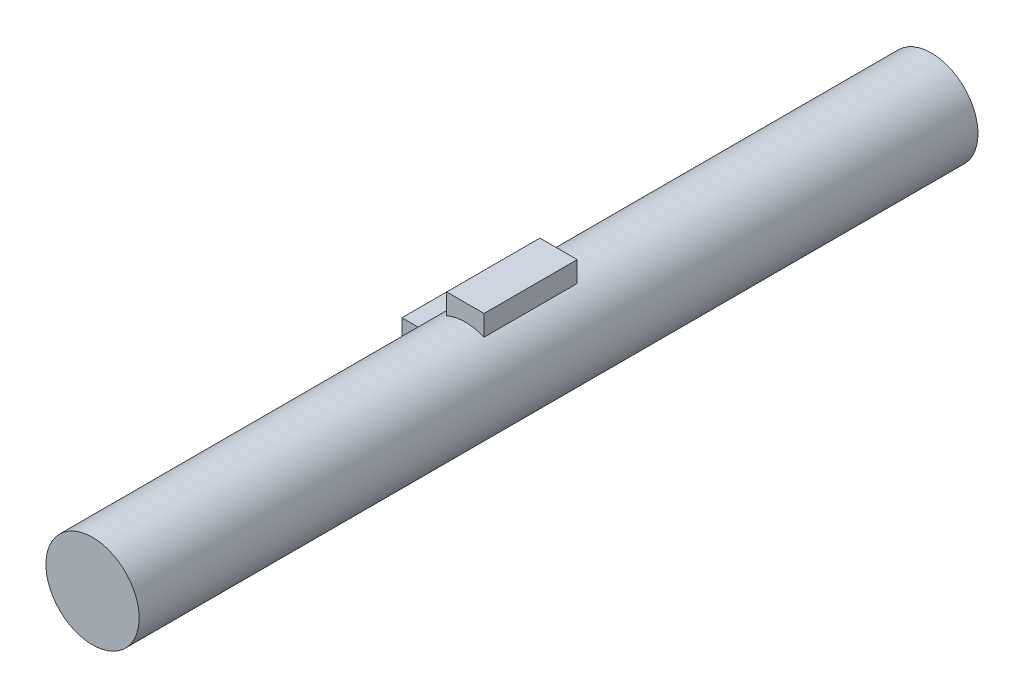
ISO-10303-21;
HEADER;
FILE_DESCRIPTION(('STEP AP214'),'2;1');
FILE_NAME('part.step','',(''),(''),'','','');
FILE_SCHEMA(('AUTOMOTIVE_DESIGN { 1 0 10303 214 1 1 1 1 }'));
ENDSEC;
DATA;
#1=APPLICATION_CONTEXT('core data for automotive mechanical design processes');
#2=APPLICATION_PROTOCOL_DEFINITION('international standard','automotive_design',2000,#1);
#3=PRODUCT_CONTEXT('',#1,'mechanical');
#4=PRODUCT('Part','Part','',(#3));
#5=PRODUCT_RELATED_PRODUCT_CATEGORY('part','',(#4));
#6=PRODUCT_DEFINITION_FORMATION('','',#4);
#7=PRODUCT_DEFINITION_CONTEXT('part definition',#1,'design');
#8=PRODUCT_DEFINITION('design','',#6,#7);
#9=PRODUCT_DEFINITION_SHAPE('','',#8);
#10=(LENGTH_UNIT() NAMED_UNIT(*) SI_UNIT(.MILLI.,.METRE.));
#11=(NAMED_UNIT(*) PLANE_ANGLE_UNIT() SI_UNIT($,.RADIAN.));
#12=(NAMED_UNIT(*) SI_UNIT($,.STERADIAN.) SOLID_ANGLE_UNIT());
#13=UNCERTAINTY_MEASURE_WITH_UNIT(LENGTH_MEASURE(1.E-05),#10,'distance_accuracy_value','');
#14=(GEOMETRIC_REPRESENTATION_CONTEXT(3) GLOBAL_UNCERTAINTY_ASSIGNED_CONTEXT((#13)) GLOBAL_UNIT_ASSIGNED_CONTEXT((#10,
#11,#12)) REPRESENTATION_CONTEXT('',''));
#15=CARTESIAN_POINT('',(0.,0.,0.));
#16=DIRECTION('',(0.,0.,1.));
#17=DIRECTION('',(1.,0.,0.));
#18=AXIS2_PLACEMENT_3D('',#15,#16,#17);
#19=CARTESIAN_POINT('',(0.,0.,0.));
#20=DIRECTION('',(0.,0.,1.));
#21=DIRECTION('',(1.,0.,0.));
#22=AXIS2_PLACEMENT_3D('',#19,#20,#21);
#23=PLANE('',#22);
#24=DIRECTION('',(0.,-1.,0.));
#25=VECTOR('',#24,1.);
#26=CARTESIAN_POINT('',(2.,6.8,0.));
#27=LINE('',#26,#25);
#28=CARTESIAN_POINT('',(2.,6.8,0.));
#29=VERTEX_POINT('',#28);
#30=CARTESIAN_POINT('',(2.,4.58257569495584,0.));
#31=VERTEX_POINT('',#30);
#32=EDGE_CURVE('E174',#29,#31,#27,.T.);
#33=ORIENTED_EDGE('',*,*,#32,.T.);
#34=CARTESIAN_POINT('',(0.,0.,0.));
#35=DIRECTION('',(0.,0.,1.));
#36=DIRECTION('',(1.,0.,0.));
#37=AXIS2_PLACEMENT_3D('',#34,#35,#36);
#38=CIRCLE('',#37,5.);
#39=CARTESIAN_POINT('',(-2.,4.58257569495584,0.));
#40=VERTEX_POINT('',#39);
#41=EDGE_CURVE('E104',#31,#40,#38,.T.);
#42=ORIENTED_EDGE('',*,*,#41,.T.);
#43=DIRECTION('',(0.,-1.,0.));
#44=VECTOR('',#43,1.);
#45=CARTESIAN_POINT('',(-2.,6.8,0.));
#46=LINE('',#45,#44);
#47=CARTESIAN_POINT('',(-2.,6.8,0.));
#48=VERTEX_POINT('',#47);
#49=EDGE_CURVE('E173',#48,#40,#46,.T.);
#50=ORIENTED_EDGE('',*,*,#49,.F.);
#51=DIRECTION('',(1.,0.,0.));
#52=VECTOR('',#51,1.);
#53=CARTESIAN_POINT('',(-2.,6.8,0.));
#54=LINE('',#53,#52);
#55=EDGE_CURVE('E188',#48,#29,#54,.T.);
#56=ORIENTED_EDGE('',*,*,#55,.T.);
#57=EDGE_LOOP('',(#33,#42,#50,#56));
#58=FACE_BOUND('',#57,.T.);
#59=ADVANCED_FACE('F93',(#58),#23,.F.);
#60=CARTESIAN_POINT('',(0.,0.,10.));
#61=DIRECTION('',(0.,0.,1.));
#62=DIRECTION('',(1.,0.,0.));
#63=AXIS2_PLACEMENT_3D('',#60,#61,#62);
#64=PLANE('',#63);
#65=DIRECTION('',(1.,0.,0.));
#66=VECTOR('',#65,1.);
#67=CARTESIAN_POINT('',(-6.8,-2.,10.));
#68=LINE('',#67,#66);
#69=CARTESIAN_POINT('',(-6.8,-2.,10.));
#70=VERTEX_POINT('',#69);
#71=CARTESIAN_POINT('',(-4.58257569495584,-2.,10.));
#72=VERTEX_POINT('',#71);
#73=EDGE_CURVE('E203',#70,#72,#68,.T.);
#74=ORIENTED_EDGE('',*,*,#73,.T.);
#75=CARTESIAN_POINT('',(0.,0.,10.));
#76=DIRECTION('',(0.,0.,1.));
#77=DIRECTION('',(1.,0.,0.));
#78=AXIS2_PLACEMENT_3D('',#75,#76,#77);
#79=CIRCLE('',#78,5.);
#80=CARTESIAN_POINT('',(-4.58257569495584,2.,10.));
#81=VERTEX_POINT('',#80);
#82=EDGE_CURVE('E136',#72,#81,#79,.F.);
#83=ORIENTED_EDGE('',*,*,#82,.T.);
#84=DIRECTION('',(1.,0.,0.));
#85=VECTOR('',#84,1.);
#86=CARTESIAN_POINT('',(-6.8,2.,10.));
#87=LINE('',#86,#85);
#88=CARTESIAN_POINT('',(-6.8,2.,10.));
#89=VERTEX_POINT('',#88);
#90=EDGE_CURVE('E200',#89,#81,#87,.T.);
#91=ORIENTED_EDGE('',*,*,#90,.F.);
#92=DIRECTION('',(0.,-1.,0.));
#93=VECTOR('',#92,1.);
#94=CARTESIAN_POINT('',(-6.8,2.,10.));
#95=LINE('',#94,#93);
#96=EDGE_CURVE('E206',#89,#70,#95,.T.);
#97=ORIENTED_EDGE('',*,*,#96,.T.);
#98=EDGE_LOOP('',(#74,#83,#91,#97));
#99=FACE_BOUND('',#98,.T.);
#100=ADVANCED_FACE('F245',(#99),#64,.T.);
#101=DIRECTION('',(0.,-1.,0.));
#102=VECTOR('',#101,1.);
#103=CARTESIAN_POINT('',(-2.,6.8,10.));
#104=LINE('',#103,#102);
#105=CARTESIAN_POINT('',(-2.,6.8,10.));
#106=VERTEX_POINT('',#105);
#107=CARTESIAN_POINT('',(-2.,4.58257569495584,10.));
#108=VERTEX_POINT('',#107);
#109=EDGE_CURVE('E197',#106,#108,#104,.T.);
#110=ORIENTED_EDGE('',*,*,#109,.T.);
#111=CARTESIAN_POINT('',(2.,4.58257569495584,10.));
#112=VERTEX_POINT('',#111);
#113=EDGE_CURVE('E182',#108,#112,#79,.F.);
#114=ORIENTED_EDGE('',*,*,#113,.T.);
#115=DIRECTION('',(0.,-1.,0.));
#116=VECTOR('',#115,1.);
#117=CARTESIAN_POINT('',(2.,6.8,10.));
#118=LINE('',#117,#116);
#119=CARTESIAN_POINT('',(2.,6.8,10.));
#120=VERTEX_POINT('',#119);
#121=EDGE_CURVE('E222',#120,#112,#118,.T.);
#122=ORIENTED_EDGE('',*,*,#121,.F.);
#123=DIRECTION('',(1.,0.,0.));
#124=VECTOR('',#123,1.);
#125=CARTESIAN_POINT('',(-2.,6.8,10.));
#126=LINE('',#125,#124);
#127=EDGE_CURVE('E193',#106,#120,#126,.T.);
#128=ORIENTED_EDGE('',*,*,#127,.F.);
#129=EDGE_LOOP('',(#110,#114,#122,#128));
#130=FACE_BOUND('',#129,.T.);
#131=ADVANCED_FACE('F224',(#130),#64,.T.);
#132=DIRECTION('',(1.,0.,0.));
#133=VECTOR('',#132,1.);
#134=CARTESIAN_POINT('',(-6.8,2.,0.));
#135=LINE('',#134,#133);
#136=CARTESIAN_POINT('',(-6.8,2.,0.));
#137=VERTEX_POINT('',#136);
#138=CARTESIAN_POINT('',(-4.58257569495584,2.,0.));
#139=VERTEX_POINT('',#138);
#140=EDGE_CURVE('E209',#137,#139,#135,.T.);
#141=ORIENTED_EDGE('',*,*,#140,.T.);
#142=CARTESIAN_POINT('',(-4.58257569495584,-2.,0.));
#143=VERTEX_POINT('',#142);
#144=EDGE_CURVE('E12',#139,#143,#38,.T.);
#145=ORIENTED_EDGE('',*,*,#144,.T.);
#146=DIRECTION('',(1.,0.,0.));
#147=VECTOR('',#146,1.);
#148=CARTESIAN_POINT('',(-6.8,-2.,0.));
#149=LINE('',#148,#147);
#150=CARTESIAN_POINT('',(-6.8,-2.,0.));
#151=VERTEX_POINT('',#150);
#152=EDGE_CURVE('E212',#151,#143,#149,.T.);
#153=ORIENTED_EDGE('',*,*,#152,.F.);
#154=DIRECTION('',(0.,-1.,0.));
#155=VECTOR('',#154,1.);
#156=CARTESIAN_POINT('',(-6.8,2.,0.));
#157=LINE('',#156,#155);
#158=EDGE_CURVE('E204',#137,#151,#157,.T.);
#159=ORIENTED_EDGE('',*,*,#158,.F.);
#160=EDGE_LOOP('',(#141,#145,#153,#159));
#161=FACE_BOUND('',#160,.T.);
#162=ADVANCED_FACE('F233',(#161),#23,.F.);
#163=CARTESIAN_POINT('',(-2.,6.8,10.));
#164=DIRECTION('',(0.,1.,0.));
#165=DIRECTION('',(0.,0.,1.));
#166=AXIS2_PLACEMENT_3D('',#163,#164,#165);
#167=PLANE('',#166);
#168=ORIENTED_EDGE('',*,*,#55,.F.);
#169=DIRECTION('',(0.,0.,-1.));
#170=VECTOR('',#169,1.);
#171=CARTESIAN_POINT('',(-2.,6.8,10.));
#172=LINE('',#171,#170);
#173=EDGE_CURVE('E185',#106,#48,#172,.T.);
#174=ORIENTED_EDGE('',*,*,#173,.F.);
#175=ORIENTED_EDGE('',*,*,#127,.T.);
#176=DIRECTION('',(0.,0.,-1.));
#177=VECTOR('',#176,1.);
#178=CARTESIAN_POINT('',(2.,6.8,10.));
#179=LINE('',#178,#177);
#180=EDGE_CURVE('E152',#120,#29,#179,.T.);
#181=ORIENTED_EDGE('',*,*,#180,.T.);
#182=EDGE_LOOP('',(#168,#174,#175,#181));
#183=FACE_BOUND('',#182,.T.);
#184=ADVANCED_FACE('F231',(#183),#167,.T.);
#185=CARTESIAN_POINT('',(-2.,6.8,10.));
#186=DIRECTION('',(1.,0.,0.));
#187=DIRECTION('',(0.,1.,0.));
#188=AXIS2_PLACEMENT_3D('',#185,#186,#187);
#189=PLANE('',#188);
#190=DIRECTION('',(0.,0.,-1.));
#191=VECTOR('',#190,1.);
#192=CARTESIAN_POINT('',(-2.,4.58257569495584,10.));
#193=LINE('',#192,#191);
#194=EDGE_CURVE('E97',#108,#40,#193,.T.);
#195=ORIENTED_EDGE('',*,*,#194,.F.);
#196=ORIENTED_EDGE('',*,*,#109,.F.);
#197=ORIENTED_EDGE('',*,*,#173,.T.);
#198=ORIENTED_EDGE('',*,*,#49,.T.);
#199=EDGE_LOOP('',(#195,#196,#197,#198));
#200=FACE_BOUND('',#199,.T.);
#201=ADVANCED_FACE('F184',(#200),#189,.F.);
#202=CARTESIAN_POINT('',(2.,6.8,10.));
#203=DIRECTION('',(1.,0.,0.));
#204=DIRECTION('',(0.,1.,0.));
#205=AXIS2_PLACEMENT_3D('',#202,#203,#204);
#206=PLANE('',#205);
#207=ORIENTED_EDGE('',*,*,#121,.T.);
#208=DIRECTION('',(0.,0.,-1.));
#209=VECTOR('',#208,1.);
#210=CARTESIAN_POINT('',(2.,4.58257569495584,10.));
#211=LINE('',#210,#209);
#212=EDGE_CURVE('E183',#112,#31,#211,.T.);
#213=ORIENTED_EDGE('',*,*,#212,.T.);
#214=ORIENTED_EDGE('',*,*,#32,.F.);
#215=ORIENTED_EDGE('',*,*,#180,.F.);
#216=EDGE_LOOP('',(#207,#213,#214,#215));
#217=FACE_BOUND('',#216,.T.);
#218=ADVANCED_FACE('F220',(#217),#206,.T.);
#219=CARTESIAN_POINT('',(-6.8,2.,10.));
#220=DIRECTION('',(1.,0.,0.));
#221=DIRECTION('',(0.,1.,0.));
#222=AXIS2_PLACEMENT_3D('',#219,#220,#221);
#223=PLANE('',#222);
#224=ORIENTED_EDGE('',*,*,#158,.T.);
#225=DIRECTION('',(0.,0.,-1.));
#226=VECTOR('',#225,1.);
#227=CARTESIAN_POINT('',(-6.8,-2.,10.));
#228=LINE('',#227,#226);
#229=EDGE_CURVE('E208',#70,#151,#228,.T.);
#230=ORIENTED_EDGE('',*,*,#229,.F.);
#231=ORIENTED_EDGE('',*,*,#96,.F.);
#232=DIRECTION('',(0.,0.,-1.));
#233=VECTOR('',#232,1.);
#234=CARTESIAN_POINT('',(-6.8,2.,10.));
#235=LINE('',#234,#233);
#236=EDGE_CURVE('E215',#89,#137,#235,.T.);
#237=ORIENTED_EDGE('',*,*,#236,.T.);
#238=EDGE_LOOP('',(#224,#230,#231,#237));
#239=FACE_BOUND('',#238,.T.);
#240=ADVANCED_FACE('F278',(#239),#223,.F.);
#241=CARTESIAN_POINT('',(-6.8,2.,10.));
#242=DIRECTION('',(0.,1.,0.));
#243=DIRECTION('',(-1.,0.,0.));
#244=AXIS2_PLACEMENT_3D('',#241,#242,#243);
#245=PLANE('',#244);
#246=ORIENTED_EDGE('',*,*,#90,.T.);
#247=DIRECTION('',(0.,0.,-1.));
#248=VECTOR('',#247,1.);
#249=CARTESIAN_POINT('',(-4.58257569495584,2.,10.));
#250=LINE('',#249,#248);
#251=EDGE_CURVE('E186',#81,#139,#250,.T.);
#252=ORIENTED_EDGE('',*,*,#251,.T.);
#253=ORIENTED_EDGE('',*,*,#140,.F.);
#254=ORIENTED_EDGE('',*,*,#236,.F.);
#255=EDGE_LOOP('',(#246,#252,#253,#254));
#256=FACE_BOUND('',#255,.T.);
#257=ADVANCED_FACE('F270',(#256),#245,.T.);
#258=CARTESIAN_POINT('',(-6.8,-2.,10.));
#259=DIRECTION('',(0.,1.,0.));
#260=DIRECTION('',(0.,0.,1.));
#261=AXIS2_PLACEMENT_3D('',#258,#259,#260);
#262=PLANE('',#261);
#263=DIRECTION('',(0.,0.,-1.));
#264=VECTOR('',#263,1.);
#265=CARTESIAN_POINT('',(-4.58257569495584,-2.,10.));
#266=LINE('',#265,#264);
#267=EDGE_CURVE('E144',#72,#143,#266,.T.);
#268=ORIENTED_EDGE('',*,*,#267,.F.);
#269=ORIENTED_EDGE('',*,*,#73,.F.);
#270=ORIENTED_EDGE('',*,*,#229,.T.);
#271=ORIENTED_EDGE('',*,*,#152,.T.);
#272=EDGE_LOOP('',(#268,#269,#270,#271));
#273=FACE_BOUND('',#272,.T.);
#274=ADVANCED_FACE('F265',(#273),#262,.F.);
#275=CARTESIAN_POINT('',(0.,0.,10.));
#276=DIRECTION('',(0.,0.,-1.));
#277=DIRECTION('',(-1.,0.,0.));
#278=AXIS2_PLACEMENT_3D('',#275,#276,#277);
#279=CYLINDRICAL_SURFACE('',#278,5.);
#280=ORIENTED_EDGE('',*,*,#144,.F.);
#281=ORIENTED_EDGE('',*,*,#251,.F.);
#282=ORIENTED_EDGE('',*,*,#82,.F.);
#283=ORIENTED_EDGE('',*,*,#267,.T.);
#284=EDGE_LOOP('',(#280,#281,#282,#283));
#285=FACE_BOUND('',#284,.T.);
#286=ORIENTED_EDGE('',*,*,#194,.T.);
#287=ORIENTED_EDGE('',*,*,#41,.F.);
#288=ORIENTED_EDGE('',*,*,#212,.F.);
#289=ORIENTED_EDGE('',*,*,#113,.F.);
#290=EDGE_LOOP('',(#286,#287,#288,#289));
#291=FACE_BOUND('',#290,.T.);
#292=CARTESIAN_POINT('',(0.,0.,50.));
#293=DIRECTION('',(0.,0.,1.));
#294=DIRECTION('',(1.,0.,0.));
#295=AXIS2_PLACEMENT_3D('',#292,#293,#294);
#296=CIRCLE('',#295,5.);
#297=CARTESIAN_POINT('',(5.,0.,50.));
#298=VERTEX_POINT('',#297);
#299=EDGE_CURVE('E226',#298,#298,#296,.T.);
#300=ORIENTED_EDGE('',*,*,#299,.F.);
#301=EDGE_LOOP('',(#300));
#302=FACE_BOUND('',#301,.T.);
#303=CARTESIAN_POINT('',(0.,0.,-40.));
#304=DIRECTION('',(0.,0.,1.));
#305=DIRECTION('',(1.,0.,0.));
#306=AXIS2_PLACEMENT_3D('',#303,#304,#305);
#307=CIRCLE('',#306,5.);
#308=CARTESIAN_POINT('',(5.,0.,-40.));
#309=VERTEX_POINT('',#308);
#310=EDGE_CURVE('E178',#309,#309,#307,.T.);
#311=ORIENTED_EDGE('',*,*,#310,.T.);
#312=EDGE_LOOP('',(#311));
#313=FACE_BOUND('',#312,.T.);
#314=ADVANCED_FACE('F95',(#285,#291,#302,#313),#279,.T.);
#315=CARTESIAN_POINT('',(0.,0.,50.));
#316=DIRECTION('',(0.,0.,1.));
#317=DIRECTION('',(1.,0.,0.));
#318=AXIS2_PLACEMENT_3D('',#315,#316,#317);
#319=PLANE('',#318);
#320=ORIENTED_EDGE('',*,*,#299,.T.);
#321=EDGE_LOOP('',(#320));
#322=FACE_BOUND('',#321,.T.);
#323=ADVANCED_FACE('F252',(#322),#319,.T.);
#324=CARTESIAN_POINT('',(0.,0.,-40.));
#325=DIRECTION('',(0.,0.,1.));
#326=DIRECTION('',(1.,0.,0.));
#327=AXIS2_PLACEMENT_3D('',#324,#325,#326);
#328=PLANE('',#327);
#329=ORIENTED_EDGE('',*,*,#310,.F.);
#330=EDGE_LOOP('',(#329));
#331=FACE_BOUND('',#330,.T.);
#332=ADVANCED_FACE('F254',(#331),#328,.F.);
#333=CLOSED_SHELL('',(#59,#100,#131,#162,#184,#201,#218,#240,#257,#274,#314,#323,#332));
#334=MANIFOLD_SOLID_BREP('B2',#333);
#335=ADVANCED_BREP_SHAPE_REPRESENTATION('',(#18,#334),#14);
#336=SHAPE_DEFINITION_REPRESENTATION(#9,#335);
ENDSEC;
END-ISO-10303-21;
